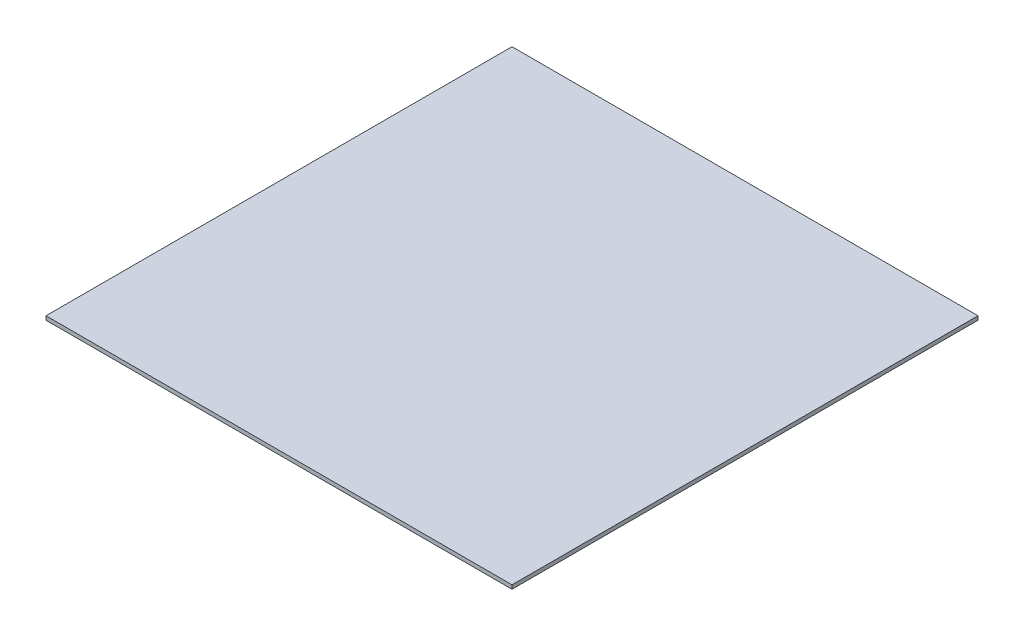
ISO-10303-21;
HEADER;
FILE_DESCRIPTION(('STEP AP214'),'2;1');
FILE_NAME('part.step','',(''),(''),'','','');
FILE_SCHEMA(('AUTOMOTIVE_DESIGN { 1 0 10303 214 1 1 1 1 }'));
ENDSEC;
DATA;
#1=APPLICATION_CONTEXT('core data for automotive mechanical design processes');
#2=APPLICATION_PROTOCOL_DEFINITION('international standard','automotive_design',2000,#1);
#3=PRODUCT_CONTEXT('',#1,'mechanical');
#4=PRODUCT('Part','Part','',(#3));
#5=PRODUCT_RELATED_PRODUCT_CATEGORY('part','',(#4));
#6=PRODUCT_DEFINITION_FORMATION('','',#4);
#7=PRODUCT_DEFINITION_CONTEXT('part definition',#1,'design');
#8=PRODUCT_DEFINITION('design','',#6,#7);
#9=PRODUCT_DEFINITION_SHAPE('','',#8);
#10=(LENGTH_UNIT() NAMED_UNIT(*) SI_UNIT(.MILLI.,.METRE.));
#11=(NAMED_UNIT(*) PLANE_ANGLE_UNIT() SI_UNIT($,.RADIAN.));
#12=(NAMED_UNIT(*) SI_UNIT($,.STERADIAN.) SOLID_ANGLE_UNIT());
#13=UNCERTAINTY_MEASURE_WITH_UNIT(LENGTH_MEASURE(1.E-05),#10,'distance_accuracy_value','');
#14=(GEOMETRIC_REPRESENTATION_CONTEXT(3) GLOBAL_UNCERTAINTY_ASSIGNED_CONTEXT((#13)) GLOBAL_UNIT_ASSIGNED_CONTEXT((#10,
#11,#12)) REPRESENTATION_CONTEXT('',''));
#15=CARTESIAN_POINT('',(0.,0.,0.));
#16=DIRECTION('',(0.,0.,1.));
#17=DIRECTION('',(1.,0.,0.));
#18=AXIS2_PLACEMENT_3D('',#15,#16,#17);
#19=CARTESIAN_POINT('',(76.2,1.27,76.2));
#20=DIRECTION('',(-1.,0.,0.));
#21=DIRECTION('',(0.,0.,1.));
#22=AXIS2_PLACEMENT_3D('',#19,#20,#21);
#23=PLANE('',#22);
#24=DIRECTION('',(0.,0.,-1.));
#25=VECTOR('',#24,1.);
#26=CARTESIAN_POINT('',(76.2,0.,76.2));
#27=LINE('',#26,#25);
#28=CARTESIAN_POINT('',(76.2,0.,76.2));
#29=VERTEX_POINT('',#28);
#30=CARTESIAN_POINT('',(76.2,0.,-76.2));
#31=VERTEX_POINT('',#30);
#32=EDGE_CURVE('E97',#29,#31,#27,.T.);
#33=ORIENTED_EDGE('',*,*,#32,.T.);
#34=DIRECTION('',(0.,-1.,0.));
#35=VECTOR('',#34,1.);
#36=CARTESIAN_POINT('',(76.2,1.27,-76.2));
#37=LINE('',#36,#35);
#38=CARTESIAN_POINT('',(76.2,1.27,-76.2));
#39=VERTEX_POINT('',#38);
#40=EDGE_CURVE('E11',#39,#31,#37,.T.);
#41=ORIENTED_EDGE('',*,*,#40,.F.);
#42=DIRECTION('',(0.,0.,-1.));
#43=VECTOR('',#42,1.);
#44=CARTESIAN_POINT('',(76.2,1.27,76.2));
#45=LINE('',#44,#43);
#46=CARTESIAN_POINT('',(76.2,1.27,76.2));
#47=VERTEX_POINT('',#46);
#48=EDGE_CURVE('E85',#47,#39,#45,.T.);
#49=ORIENTED_EDGE('',*,*,#48,.F.);
#50=DIRECTION('',(0.,-1.,0.));
#51=VECTOR('',#50,1.);
#52=CARTESIAN_POINT('',(76.2,1.27,76.2));
#53=LINE('',#52,#51);
#54=EDGE_CURVE('E93',#47,#29,#53,.T.);
#55=ORIENTED_EDGE('',*,*,#54,.T.);
#56=EDGE_LOOP('',(#33,#41,#49,#55));
#57=FACE_BOUND('',#56,.T.);
#58=ADVANCED_FACE('F34',(#57),#23,.F.);
#59=CARTESIAN_POINT('',(-76.2,1.27,-76.2));
#60=DIRECTION('',(0.,0.,1.));
#61=DIRECTION('',(1.,0.,0.));
#62=AXIS2_PLACEMENT_3D('',#59,#60,#61);
#63=PLANE('',#62);
#64=DIRECTION('',(-1.,0.,0.));
#65=VECTOR('',#64,1.);
#66=CARTESIAN_POINT('',(-76.2,0.,-76.2));
#67=LINE('',#66,#65);
#68=CARTESIAN_POINT('',(-76.2,0.,-76.2));
#69=VERTEX_POINT('',#68);
#70=EDGE_CURVE('E89',#31,#69,#67,.T.);
#71=ORIENTED_EDGE('',*,*,#70,.T.);
#72=DIRECTION('',(0.,-1.,0.));
#73=VECTOR('',#72,1.);
#74=CARTESIAN_POINT('',(-76.2,1.27,-76.2));
#75=LINE('',#74,#73);
#76=CARTESIAN_POINT('',(-76.2,1.27,-76.2));
#77=VERTEX_POINT('',#76);
#78=EDGE_CURVE('E42',#77,#69,#75,.T.);
#79=ORIENTED_EDGE('',*,*,#78,.F.);
#80=DIRECTION('',(-1.,0.,0.));
#81=VECTOR('',#80,1.);
#82=CARTESIAN_POINT('',(-76.2,1.27,-76.2));
#83=LINE('',#82,#81);
#84=EDGE_CURVE('E80',#39,#77,#83,.T.);
#85=ORIENTED_EDGE('',*,*,#84,.F.);
#86=ORIENTED_EDGE('',*,*,#40,.T.);
#87=EDGE_LOOP('',(#71,#79,#85,#86));
#88=FACE_BOUND('',#87,.T.);
#89=ADVANCED_FACE('F88',(#88),#63,.F.);
#90=CARTESIAN_POINT('',(-76.2,1.27,76.2));
#91=DIRECTION('',(1.,0.,0.));
#92=DIRECTION('',(0.,0.,-1.));
#93=AXIS2_PLACEMENT_3D('',#90,#91,#92);
#94=PLANE('',#93);
#95=DIRECTION('',(0.,0.,1.));
#96=VECTOR('',#95,1.);
#97=CARTESIAN_POINT('',(-76.2,0.,76.2));
#98=LINE('',#97,#96);
#99=CARTESIAN_POINT('',(-76.2,0.,76.2));
#100=VERTEX_POINT('',#99);
#101=EDGE_CURVE('E67',#69,#100,#98,.T.);
#102=ORIENTED_EDGE('',*,*,#101,.T.);
#103=DIRECTION('',(0.,-1.,0.));
#104=VECTOR('',#103,1.);
#105=CARTESIAN_POINT('',(-76.2,1.27,76.2));
#106=LINE('',#105,#104);
#107=CARTESIAN_POINT('',(-76.2,1.27,76.2));
#108=VERTEX_POINT('',#107);
#109=EDGE_CURVE('E90',#108,#100,#106,.T.);
#110=ORIENTED_EDGE('',*,*,#109,.F.);
#111=DIRECTION('',(0.,0.,1.));
#112=VECTOR('',#111,1.);
#113=CARTESIAN_POINT('',(-76.2,1.27,76.2));
#114=LINE('',#113,#112);
#115=EDGE_CURVE('E83',#77,#108,#114,.T.);
#116=ORIENTED_EDGE('',*,*,#115,.F.);
#117=ORIENTED_EDGE('',*,*,#78,.T.);
#118=EDGE_LOOP('',(#102,#110,#116,#117));
#119=FACE_BOUND('',#118,.T.);
#120=ADVANCED_FACE('F91',(#119),#94,.F.);
#121=CARTESIAN_POINT('',(-76.2,1.27,76.2));
#122=DIRECTION('',(0.,0.,-1.));
#123=DIRECTION('',(-1.,0.,0.));
#124=AXIS2_PLACEMENT_3D('',#121,#122,#123);
#125=PLANE('',#124);
#126=DIRECTION('',(1.,0.,0.));
#127=VECTOR('',#126,1.);
#128=CARTESIAN_POINT('',(-76.2,0.,76.2));
#129=LINE('',#128,#127);
#130=EDGE_CURVE('E73',#100,#29,#129,.T.);
#131=ORIENTED_EDGE('',*,*,#130,.T.);
#132=ORIENTED_EDGE('',*,*,#54,.F.);
#133=DIRECTION('',(1.,0.,0.));
#134=VECTOR('',#133,1.);
#135=CARTESIAN_POINT('',(-76.2,1.27,76.2));
#136=LINE('',#135,#134);
#137=EDGE_CURVE('E50',#108,#47,#136,.T.);
#138=ORIENTED_EDGE('',*,*,#137,.F.);
#139=ORIENTED_EDGE('',*,*,#109,.T.);
#140=EDGE_LOOP('',(#131,#132,#138,#139));
#141=FACE_BOUND('',#140,.T.);
#142=ADVANCED_FACE('F104',(#141),#125,.F.);
#143=CARTESIAN_POINT('',(0.,1.27,0.));
#144=DIRECTION('',(0.,-1.,0.));
#145=DIRECTION('',(0.,0.,-1.));
#146=AXIS2_PLACEMENT_3D('',#143,#144,#145);
#147=PLANE('',#146);
#148=ORIENTED_EDGE('',*,*,#48,.T.);
#149=ORIENTED_EDGE('',*,*,#84,.T.);
#150=ORIENTED_EDGE('',*,*,#115,.T.);
#151=ORIENTED_EDGE('',*,*,#137,.T.);
#152=EDGE_LOOP('',(#148,#149,#150,#151));
#153=FACE_BOUND('',#152,.T.);
#154=ADVANCED_FACE('F81',(#153),#147,.F.);
#155=CARTESIAN_POINT('',(0.,0.,0.));
#156=DIRECTION('',(0.,-1.,0.));
#157=DIRECTION('',(0.,0.,-1.));
#158=AXIS2_PLACEMENT_3D('',#155,#156,#157);
#159=PLANE('',#158);
#160=ORIENTED_EDGE('',*,*,#32,.F.);
#161=ORIENTED_EDGE('',*,*,#130,.F.);
#162=ORIENTED_EDGE('',*,*,#101,.F.);
#163=ORIENTED_EDGE('',*,*,#70,.F.);
#164=EDGE_LOOP('',(#160,#161,#162,#163));
#165=FACE_BOUND('',#164,.T.);
#166=ADVANCED_FACE('F107',(#165),#159,.T.);
#167=CLOSED_SHELL('',(#58,#89,#120,#142,#154,#166));
#168=MANIFOLD_SOLID_BREP('B2',#167);
#169=ADVANCED_BREP_SHAPE_REPRESENTATION('',(#18,#168),#14);
#170=SHAPE_DEFINITION_REPRESENTATION(#9,#169);
ENDSEC;
END-ISO-10303-21;
